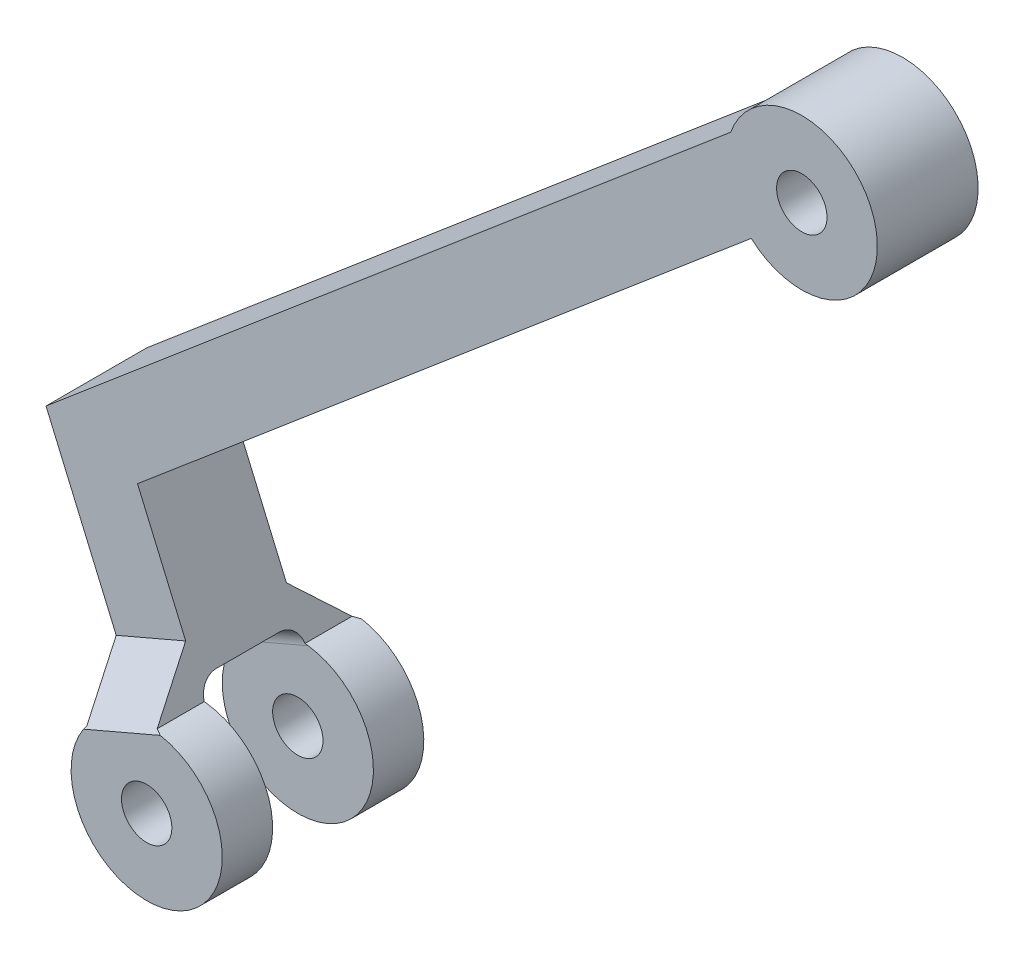
ISO-10303-21;
HEADER;
FILE_DESCRIPTION(('STEP AP214'),'2;1');
FILE_NAME('part.step','',(''),(''),'','','');
FILE_SCHEMA(('AUTOMOTIVE_DESIGN { 1 0 10303 214 1 1 1 1 }'));
ENDSEC;
DATA;
#1=APPLICATION_CONTEXT('core data for automotive mechanical design processes');
#2=APPLICATION_PROTOCOL_DEFINITION('international standard','automotive_design',2000,#1);
#3=PRODUCT_CONTEXT('',#1,'mechanical');
#4=PRODUCT('Part','Part','',(#3));
#5=PRODUCT_RELATED_PRODUCT_CATEGORY('part','',(#4));
#6=PRODUCT_DEFINITION_FORMATION('','',#4);
#7=PRODUCT_DEFINITION_CONTEXT('part definition',#1,'design');
#8=PRODUCT_DEFINITION('design','',#6,#7);
#9=PRODUCT_DEFINITION_SHAPE('','',#8);
#10=(LENGTH_UNIT() NAMED_UNIT(*) SI_UNIT(.MILLI.,.METRE.));
#11=(NAMED_UNIT(*) PLANE_ANGLE_UNIT() SI_UNIT($,.RADIAN.));
#12=(NAMED_UNIT(*) SI_UNIT($,.STERADIAN.) SOLID_ANGLE_UNIT());
#13=UNCERTAINTY_MEASURE_WITH_UNIT(LENGTH_MEASURE(1.E-05),#10,'distance_accuracy_value','');
#14=(GEOMETRIC_REPRESENTATION_CONTEXT(3) GLOBAL_UNCERTAINTY_ASSIGNED_CONTEXT((#13)) GLOBAL_UNIT_ASSIGNED_CONTEXT((#10,
#11,#12)) REPRESENTATION_CONTEXT('',''));
#15=CARTESIAN_POINT('',(0.,0.,0.));
#16=DIRECTION('',(0.,0.,1.));
#17=DIRECTION('',(1.,0.,0.));
#18=AXIS2_PLACEMENT_3D('',#15,#16,#17);
#19=CARTESIAN_POINT('',(17.8900769018501,43.1295249088939,2.));
#20=DIRECTION('',(0.,0.,-1.));
#21=DIRECTION('',(-1.,0.,0.));
#22=AXIS2_PLACEMENT_3D('',#19,#20,#21);
#23=CYLINDRICAL_SURFACE('',#22,3.);
#24=CARTESIAN_POINT('',(17.8900769018501,43.1295249088939,4.));
#25=DIRECTION('',(0.,0.,1.));
#26=DIRECTION('',(1.,0.,0.));
#27=AXIS2_PLACEMENT_3D('',#24,#25,#26);
#28=CIRCLE('',#27,3.);
#29=CARTESIAN_POINT('',(15.3798128280835,44.77225869133,4.));
#30=VERTEX_POINT('',#29);
#31=CARTESIAN_POINT('',(18.427288536158,46.081033618006,4.));
#32=VERTEX_POINT('',#31);
#33=EDGE_CURVE('E314',#30,#32,#28,.T.);
#34=ORIENTED_EDGE('',*,*,#33,.F.);
#35=CARTESIAN_POINT('',(17.8900769018501,43.1295249088939,6.50000000000002));
#36=DIRECTION('',(-0.279031751915575,0.649724004037812,0.707106781186546));
#37=DIRECTION('',(-0.279031751915574,0.649724004037809,-0.707106781186549));
#38=AXIS2_PLACEMENT_3D('',#35,#36,#37);
#39=ELLIPSE('',#38,4.24264068711929,3.);
#40=CARTESIAN_POINT('',(15.4453576268852,44.8683025446527,3.93761491463644));
#41=VERTEX_POINT('',#40);
#42=EDGE_CURVE('E241',#30,#41,#39,.F.);
#43=ORIENTED_EDGE('',*,*,#42,.T.);
#44=DIRECTION('',(0.,0.,-1.));
#45=VECTOR('',#44,1.);
#46=CARTESIAN_POINT('',(15.4453576268852,44.8683025446527,2.));
#47=LINE('',#46,#45);
#48=CARTESIAN_POINT('',(15.4453576268852,44.8683025446527,2.));
#49=VERTEX_POINT('',#48);
#50=EDGE_CURVE('E182',#41,#49,#47,.T.);
#51=ORIENTED_EDGE('',*,*,#50,.T.);
#52=CARTESIAN_POINT('',(17.8900769018501,43.1295249088939,2.));
#53=DIRECTION('',(0.,0.,1.));
#54=DIRECTION('',(0.,-1.,0.));
#55=AXIS2_PLACEMENT_3D('',#52,#53,#54);
#56=CIRCLE('',#55,3.);
#57=CARTESIAN_POINT('',(18.3057004485782,46.1005949295103,2.));
#58=VERTEX_POINT('',#57);
#59=EDGE_CURVE('E210',#49,#58,#56,.T.);
#60=ORIENTED_EDGE('',*,*,#59,.T.);
#61=CARTESIAN_POINT('',(18.3057004485782,46.1005949295103,2.));
#62=CARTESIAN_POINT('',(18.2838749316499,46.1036478178896,1.99998179933336));
#63=CARTESIAN_POINT('',(18.2620262021173,46.1064592426506,1.99973056854574));
#64=CARTESIAN_POINT('',(18.2182823177778,46.1115991649439,1.99876204672711));
#65=CARTESIAN_POINT('',(18.1963871629708,46.1139276624746,1.9980447556947));
#66=CARTESIAN_POINT('',(18.1744687955593,46.1160146963857,1.99709443453991));
#67=B_SPLINE_CURVE_WITH_KNOTS('',3,(#61,#62,#63,#64,#65,#66),.UNSPECIFIED.,.F.,.F.,(4,2,4),(0.,
0.066090906141132,0.132181812480776),.UNSPECIFIED.);
#68=CARTESIAN_POINT('',(18.1744687955593,46.1160146963857,1.99709443453986));
#69=VERTEX_POINT('',#68);
#70=EDGE_CURVE('E399',#58,#69,#67,.T.);
#71=ORIENTED_EDGE('',*,*,#70,.T.);
#72=DIRECTION('',(0.,0.,-1.));
#73=VECTOR('',#72,1.);
#74=CARTESIAN_POINT('',(18.1744687955593,46.1160146963857,2.));
#75=LINE('',#74,#73);
#76=CARTESIAN_POINT('',(18.1744687955593,46.1160146963857,3.86809236747523));
#77=VERTEX_POINT('',#76);
#78=EDGE_CURVE('E59',#77,#69,#75,.T.);
#79=ORIENTED_EDGE('',*,*,#78,.F.);
#80=CARTESIAN_POINT('',(17.8900769018501,43.1295249088939,6.50000000000002));
#81=DIRECTION('',(-0.279031751915575,0.649724004037812,0.707106781186546));
#82=DIRECTION('',(-0.279031751915574,0.649724004037809,-0.707106781186549));
#83=AXIS2_PLACEMENT_3D('',#80,#81,#82);
#84=ELLIPSE('',#83,4.24264068711929,3.);
#85=EDGE_CURVE('E238',#77,#32,#84,.F.);
#86=ORIENTED_EDGE('',*,*,#85,.T.);
#87=EDGE_LOOP('',(#34,#43,#51,#60,#71,#79,#86));
#88=FACE_BOUND('',#87,.T.);
#89=ADVANCED_FACE('F42',(#88),#23,.T.);
#90=CARTESIAN_POINT('',(17.8900769018501,43.1295249088939,2.));
#91=DIRECTION('',(0.,0.,-1.));
#92=DIRECTION('',(-1.,0.,0.));
#93=AXIS2_PLACEMENT_3D('',#90,#91,#92);
#94=CYLINDRICAL_SURFACE('',#93,1.);
#95=CARTESIAN_POINT('',(17.8900769018501,43.1295249088939,2.));
#96=DIRECTION('',(0.,0.,1.));
#97=DIRECTION('',(0.,-1.,0.));
#98=AXIS2_PLACEMENT_3D('',#95,#96,#97);
#99=CIRCLE('',#98,1.);
#100=CARTESIAN_POINT('',(17.8900769018501,42.1295249088939,2.));
#101=VERTEX_POINT('',#100);
#102=EDGE_CURVE('E176',#101,#101,#99,.T.);
#103=ORIENTED_EDGE('',*,*,#102,.F.);
#104=EDGE_LOOP('',(#103));
#105=FACE_BOUND('',#104,.T.);
#106=CARTESIAN_POINT('',(17.8900769018501,43.1295249088939,4.));
#107=DIRECTION('',(0.,0.,1.));
#108=DIRECTION('',(1.,0.,0.));
#109=AXIS2_PLACEMENT_3D('',#106,#107,#108);
#110=CIRCLE('',#109,0.999999999999998);
#111=CARTESIAN_POINT('',(18.8900769018501,43.1295249088939,4.));
#112=VERTEX_POINT('',#111);
#113=EDGE_CURVE('E328',#112,#112,#110,.T.);
#114=ORIENTED_EDGE('',*,*,#113,.T.);
#115=EDGE_LOOP('',(#114));
#116=FACE_BOUND('',#115,.T.);
#117=ADVANCED_FACE('F303',(#105,#116),#94,.F.);
#118=CARTESIAN_POINT('',(0.,0.,2.));
#119=DIRECTION('',(0.,0.,1.));
#120=DIRECTION('',(1.,0.,0.));
#121=AXIS2_PLACEMENT_3D('',#118,#119,#120);
#122=PLANE('',#121);
#123=CARTESIAN_POINT('',(41.8945256681437,75.1261878509319,2.));
#124=DIRECTION('',(0.,0.,1.));
#125=DIRECTION('',(1.,0.,0.));
#126=AXIS2_PLACEMENT_3D('',#123,#124,#125);
#127=CIRCLE('',#126,0.999999999999998);
#128=CARTESIAN_POINT('',(42.8945256681437,75.1261878509319,2.));
#129=VERTEX_POINT('',#128);
#130=EDGE_CURVE('E353',#129,#129,#127,.T.);
#131=ORIENTED_EDGE('',*,*,#130,.F.);
#132=EDGE_LOOP('',(#131));
#133=FACE_BOUND('',#132,.T.);
#134=DIRECTION('',(-0.394610487891735,0.918848498309622,0.));
#135=VECTOR('',#134,1.);
#136=CARTESIAN_POINT('',(29.3089207423203,12.5870668940354,2.));
#137=LINE('',#136,#135);
#138=CARTESIAN_POINT('',(14.6807544600742,46.6486770992688,2.));
#139=VERTEX_POINT('',#138);
#140=CARTESIAN_POINT('',(11.8938632358596,53.1379390294393,2.));
#141=VERTEX_POINT('',#140);
#142=EDGE_CURVE('E346',#139,#141,#137,.T.);
#143=ORIENTED_EDGE('',*,*,#142,.F.);
#144=DIRECTION('',(0.918848498309624,0.394610487891731,0.));
#145=VECTOR('',#144,1.);
#146=CARTESIAN_POINT('',(-14.628166282246,34.0616102052335,2.));
#147=LINE('',#146,#145);
#148=CARTESIAN_POINT('',(17.4372999550031,47.8325085629439,2.));
#149=VERTEX_POINT('',#148);
#150=EDGE_CURVE('E320',#139,#149,#147,.T.);
#151=ORIENTED_EDGE('',*,*,#150,.T.);
#152=DIRECTION('',(0.394610487891735,-0.918848498309622,0.));
#153=VECTOR('',#152,1.);
#154=CARTESIAN_POINT('',(32.0654662372491,13.7708983577106,2.));
#155=LINE('',#154,#153);
#156=CARTESIAN_POINT('',(15.5264342404228,52.2819495843776,2.));
#157=VERTEX_POINT('',#156);
#158=EDGE_CURVE('E349',#157,#149,#155,.T.);
#159=ORIENTED_EDGE('',*,*,#158,.F.);
#160=DIRECTION('',(-0.763351852273838,-0.64598293292478,0.));
#161=VECTOR('',#160,1.);
#162=CARTESIAN_POINT('',(-19.3017836873064,22.808733139719,2.));
#163=LINE('',#162,#161);
#164=CARTESIAN_POINT('',(39.8869482106765,72.8969205380532,2.));
#165=VERTEX_POINT('',#164);
#166=EDGE_CURVE('E334',#165,#157,#163,.T.);
#167=ORIENTED_EDGE('',*,*,#166,.F.);
#168=CARTESIAN_POINT('',(41.8945256681437,75.1261878509319,2.));
#169=DIRECTION('',(0.,0.,1.));
#170=DIRECTION('',(1.,0.,0.));
#171=AXIS2_PLACEMENT_3D('',#168,#169,#170);
#172=CIRCLE('',#171,3.);
#173=CARTESIAN_POINT('',(39.0692119800156,76.1349507386691,2.));
#174=VERTEX_POINT('',#173);
#175=EDGE_CURVE('E338',#165,#174,#172,.T.);
#176=ORIENTED_EDGE('',*,*,#175,.T.);
#177=DIRECTION('',(0.763351852273837,0.645982932924781,0.));
#178=VECTOR('',#177,1.);
#179=CARTESIAN_POINT('',(-21.2397324860807,25.0987886965404,2.));
#180=LINE('',#179,#178);
#181=EDGE_CURVE('E342',#141,#174,#180,.T.);
#182=ORIENTED_EDGE('',*,*,#181,.F.);
#183=EDGE_LOOP('',(#143,#151,#159,#167,#176,#182));
#184=FACE_BOUND('',#183,.T.);
#185=ADVANCED_FACE('F308',(#133,#184),#122,.T.);
#186=CARTESIAN_POINT('',(0.,0.,-2.));
#187=DIRECTION('',(0.,0.,1.));
#188=DIRECTION('',(1.,0.,0.));
#189=AXIS2_PLACEMENT_3D('',#186,#187,#188);
#190=PLANE('',#189);
#191=CARTESIAN_POINT('',(41.8945256681437,75.1261878509319,-2.));
#192=DIRECTION('',(0.,0.,1.));
#193=DIRECTION('',(1.,0.,0.));
#194=AXIS2_PLACEMENT_3D('',#191,#192,#193);
#195=CIRCLE('',#194,0.999999999999998);
#196=CARTESIAN_POINT('',(42.8945256681437,75.1261878509319,-2.));
#197=VERTEX_POINT('',#196);
#198=EDGE_CURVE('E339',#197,#197,#195,.T.);
#199=ORIENTED_EDGE('',*,*,#198,.T.);
#200=EDGE_LOOP('',(#199));
#201=FACE_BOUND('',#200,.T.);
#202=DIRECTION('',(0.918848498309624,0.394610487891731,0.));
#203=VECTOR('',#202,1.);
#204=CARTESIAN_POINT('',(-14.628166282246,34.0616102052335,-2.));
#205=LINE('',#204,#203);
#206=CARTESIAN_POINT('',(14.6807544600742,46.6486770992688,-2.));
#207=VERTEX_POINT('',#206);
#208=CARTESIAN_POINT('',(17.4372999550031,47.8325085629439,-2.));
#209=VERTEX_POINT('',#208);
#210=EDGE_CURVE('E199',#207,#209,#205,.T.);
#211=ORIENTED_EDGE('',*,*,#210,.F.);
#212=DIRECTION('',(-0.394610487891735,0.918848498309622,0.));
#213=VECTOR('',#212,1.);
#214=CARTESIAN_POINT('',(29.3089207423203,12.5870668940354,-2.));
#215=LINE('',#214,#213);
#216=CARTESIAN_POINT('',(11.8938632358596,53.1379390294393,-2.));
#217=VERTEX_POINT('',#216);
#218=EDGE_CURVE('E369',#207,#217,#215,.T.);
#219=ORIENTED_EDGE('',*,*,#218,.T.);
#220=DIRECTION('',(0.763351852273837,0.645982932924781,0.));
#221=VECTOR('',#220,1.);
#222=CARTESIAN_POINT('',(-21.2397324860807,25.0987886965404,-2.));
#223=LINE('',#222,#221);
#224=CARTESIAN_POINT('',(39.0692119800156,76.1349507386691,-2.));
#225=VERTEX_POINT('',#224);
#226=EDGE_CURVE('E365',#217,#225,#223,.T.);
#227=ORIENTED_EDGE('',*,*,#226,.T.);
#228=CARTESIAN_POINT('',(41.8945256681437,75.1261878509319,-2.));
#229=DIRECTION('',(0.,0.,1.));
#230=DIRECTION('',(1.,0.,0.));
#231=AXIS2_PLACEMENT_3D('',#228,#229,#230);
#232=CIRCLE('',#231,3.);
#233=CARTESIAN_POINT('',(39.8869482106765,72.8969205380532,-2.));
#234=VERTEX_POINT('',#233);
#235=EDGE_CURVE('E361',#234,#225,#232,.T.);
#236=ORIENTED_EDGE('',*,*,#235,.F.);
#237=DIRECTION('',(-0.763351852273838,-0.64598293292478,0.));
#238=VECTOR('',#237,1.);
#239=CARTESIAN_POINT('',(-19.3017836873064,22.808733139719,-2.));
#240=LINE('',#239,#238);
#241=CARTESIAN_POINT('',(15.5264342404228,52.2819495843776,-2.));
#242=VERTEX_POINT('',#241);
#243=EDGE_CURVE('E325',#234,#242,#240,.T.);
#244=ORIENTED_EDGE('',*,*,#243,.T.);
#245=DIRECTION('',(0.394610487891735,-0.918848498309622,0.));
#246=VECTOR('',#245,1.);
#247=CARTESIAN_POINT('',(32.0654662372491,13.7708983577106,-2.));
#248=LINE('',#247,#246);
#249=EDGE_CURVE('E372',#242,#209,#248,.T.);
#250=ORIENTED_EDGE('',*,*,#249,.T.);
#251=EDGE_LOOP('',(#211,#219,#227,#236,#244,#250));
#252=FACE_BOUND('',#251,.T.);
#253=ADVANCED_FACE('F289',(#201,#252),#190,.F.);
#254=CARTESIAN_POINT('',(-19.3017836873064,22.808733139719,2.));
#255=DIRECTION('',(0.64598293292478,-0.763351852273838,0.));
#256=DIRECTION('',(0.763351852273838,0.64598293292478,0.));
#257=AXIS2_PLACEMENT_3D('',#254,#255,#256);
#258=PLANE('',#257);
#259=ORIENTED_EDGE('',*,*,#243,.F.);
#260=DIRECTION('',(0.,0.,-1.));
#261=VECTOR('',#260,1.);
#262=CARTESIAN_POINT('',(39.8869482106765,72.8969205380532,2.));
#263=LINE('',#262,#261);
#264=EDGE_CURVE('E196',#165,#234,#263,.T.);
#265=ORIENTED_EDGE('',*,*,#264,.F.);
#266=ORIENTED_EDGE('',*,*,#166,.T.);
#267=DIRECTION('',(0.,0.,-1.));
#268=VECTOR('',#267,1.);
#269=CARTESIAN_POINT('',(15.5264342404228,52.2819495843776,2.));
#270=LINE('',#269,#268);
#271=EDGE_CURVE('E357',#157,#242,#270,.T.);
#272=ORIENTED_EDGE('',*,*,#271,.T.);
#273=EDGE_LOOP('',(#259,#265,#266,#272));
#274=FACE_BOUND('',#273,.T.);
#275=ADVANCED_FACE('F285',(#274),#258,.T.);
#276=CARTESIAN_POINT('',(41.8945256681437,75.1261878509319,2.));
#277=DIRECTION('',(0.,0.,-1.));
#278=DIRECTION('',(-1.,0.,0.));
#279=AXIS2_PLACEMENT_3D('',#276,#277,#278);
#280=CYLINDRICAL_SURFACE('',#279,3.);
#281=ORIENTED_EDGE('',*,*,#235,.T.);
#282=DIRECTION('',(0.,0.,-1.));
#283=VECTOR('',#282,1.);
#284=CARTESIAN_POINT('',(39.0692119800156,76.1349507386691,2.));
#285=LINE('',#284,#283);
#286=EDGE_CURVE('E193',#174,#225,#285,.T.);
#287=ORIENTED_EDGE('',*,*,#286,.F.);
#288=ORIENTED_EDGE('',*,*,#175,.F.);
#289=ORIENTED_EDGE('',*,*,#264,.T.);
#290=EDGE_LOOP('',(#281,#287,#288,#289));
#291=FACE_BOUND('',#290,.T.);
#292=ADVANCED_FACE('F288',(#291),#280,.T.);
#293=CARTESIAN_POINT('',(-21.2397324860807,25.0987886965404,2.));
#294=DIRECTION('',(-0.645982932924781,0.763351852273837,0.));
#295=DIRECTION('',(-0.763351852273837,-0.645982932924781,0.));
#296=AXIS2_PLACEMENT_3D('',#293,#294,#295);
#297=PLANE('',#296);
#298=ORIENTED_EDGE('',*,*,#226,.F.);
#299=DIRECTION('',(0.,0.,-1.));
#300=VECTOR('',#299,1.);
#301=CARTESIAN_POINT('',(11.8938632358596,53.1379390294393,2.));
#302=LINE('',#301,#300);
#303=EDGE_CURVE('E186',#141,#217,#302,.T.);
#304=ORIENTED_EDGE('',*,*,#303,.F.);
#305=ORIENTED_EDGE('',*,*,#181,.T.);
#306=ORIENTED_EDGE('',*,*,#286,.T.);
#307=EDGE_LOOP('',(#298,#304,#305,#306));
#308=FACE_BOUND('',#307,.T.);
#309=ADVANCED_FACE('F293',(#308),#297,.T.);
#310=CARTESIAN_POINT('',(29.3089207423203,12.5870668940354,2.));
#311=DIRECTION('',(-0.918848498309622,-0.394610487891735,0.));
#312=DIRECTION('',(0.394610487891735,-0.918848498309622,0.));
#313=AXIS2_PLACEMENT_3D('',#310,#311,#312);
#314=PLANE('',#313);
#315=ORIENTED_EDGE('',*,*,#218,.F.);
#316=DIRECTION('',(-0.279031751915578,0.649724004037811,0.707106781186545));
#317=VECTOR('',#316,1.);
#318=CARTESIAN_POINT('',(21.2056166254138,31.4555689932712,-18.5349436103425));
#319=LINE('',#318,#317);
#320=CARTESIAN_POINT('',(15.4453576268852,44.8683025446527,-3.93761491463642));
#321=VERTEX_POINT('',#320);
#322=EDGE_CURVE('E180',#207,#321,#319,.F.);
#323=ORIENTED_EDGE('',*,*,#322,.T.);
#324=CARTESIAN_POINT('',(15.4453576268852,44.8683025446527,-2.));
#325=VERTEX_POINT('',#324);
#326=EDGE_CURVE('E159',#325,#321,#47,.T.);
#327=ORIENTED_EDGE('',*,*,#326,.F.);
#328=DIRECTION('',(0.394610487891735,-0.918848498309622,0.));
#329=VECTOR('',#328,1.);
#330=CARTESIAN_POINT('',(29.3089207423203,12.5870668940354,-2.));
#331=LINE('',#330,#329);
#332=CARTESIAN_POINT('',(15.4439493682441,44.87158166768,-2.));
#333=VERTEX_POINT('',#332);
#334=EDGE_CURVE('E166',#333,#325,#331,.T.);
#335=ORIENTED_EDGE('',*,*,#334,.F.);
#336=CARTESIAN_POINT('',(15.4439493682441,44.87158166768,-1.25));
#337=DIRECTION('',(-0.918848498309622,-0.394610487891735,0.));
#338=DIRECTION('',(0.394610487891735,-0.918848498309622,0.));
#339=AXIS2_PLACEMENT_3D('',#336,#337,#338);
#340=CIRCLE('',#339,0.75);
#341=CARTESIAN_POINT('',(15.1479915023253,45.5607180414122,-1.25));
#342=VERTEX_POINT('',#341);
#343=EDGE_CURVE('E267',#333,#342,#340,.F.);
#344=ORIENTED_EDGE('',*,*,#343,.T.);
#345=DIRECTION('',(0.,0.,-1.));
#346=VECTOR('',#345,1.);
#347=CARTESIAN_POINT('',(15.1479915023253,45.5607180414122,2.));
#348=LINE('',#347,#346);
#349=CARTESIAN_POINT('',(15.1479915023253,45.5607180414122,1.25));
#350=VERTEX_POINT('',#349);
#351=EDGE_CURVE('E415',#350,#342,#348,.T.);
#352=ORIENTED_EDGE('',*,*,#351,.F.);
#353=CARTESIAN_POINT('',(15.4439493682441,44.87158166768,1.25));
#354=DIRECTION('',(-0.918848498309622,-0.394610487891735,0.));
#355=DIRECTION('',(0.394610487891735,-0.918848498309622,0.));
#356=AXIS2_PLACEMENT_3D('',#353,#354,#355);
#357=CIRCLE('',#356,0.75);
#358=CARTESIAN_POINT('',(15.4439493682441,44.87158166768,2.));
#359=VERTEX_POINT('',#358);
#360=EDGE_CURVE('E11',#350,#359,#357,.F.);
#361=ORIENTED_EDGE('',*,*,#360,.T.);
#362=DIRECTION('',(-0.394610487891735,0.918848498309622,0.));
#363=VECTOR('',#362,1.);
#364=CARTESIAN_POINT('',(29.3089207423203,12.5870668940354,2.));
#365=LINE('',#364,#363);
#366=EDGE_CURVE('E420',#49,#359,#365,.T.);
#367=ORIENTED_EDGE('',*,*,#366,.F.);
#368=ORIENTED_EDGE('',*,*,#50,.F.);
#369=DIRECTION('',(-0.279031751915577,0.649724004037808,-0.707106781186549));
#370=VECTOR('',#369,1.);
#371=CARTESIAN_POINT('',(21.9948376011972,29.6178719966522,20.5349436103424));
#372=LINE('',#371,#370);
#373=EDGE_CURVE('E214',#41,#139,#372,.T.);
#374=ORIENTED_EDGE('',*,*,#373,.T.);
#375=ORIENTED_EDGE('',*,*,#142,.T.);
#376=ORIENTED_EDGE('',*,*,#303,.T.);
#377=EDGE_LOOP('',(#315,#323,#327,#335,#344,#352,#361,#367,#368,#374,#375,#376));
#378=FACE_BOUND('',#377,.T.);
#379=ADVANCED_FACE('F179',(#378),#314,.T.);
#380=ORIENTED_EDGE('',*,*,#326,.T.);
#381=CARTESIAN_POINT('',(17.8900769018501,43.1295249088939,-6.49999999999998));
#382=DIRECTION('',(0.279031751915574,-0.649724004037809,0.70710678118655));
#383=DIRECTION('',(0.279031751915576,-0.649724004037813,-0.707106781186545));
#384=AXIS2_PLACEMENT_3D('',#381,#382,#383);
#385=ELLIPSE('',#384,4.24264068711927,3.);
#386=CARTESIAN_POINT('',(15.3798128280835,44.77225869133,-4.));
#387=VERTEX_POINT('',#386);
#388=EDGE_CURVE('E222',#321,#387,#385,.T.);
#389=ORIENTED_EDGE('',*,*,#388,.T.);
#390=CARTESIAN_POINT('',(17.8900769018501,43.1295249088939,-4.));
#391=DIRECTION('',(0.,0.,1.));
#392=DIRECTION('',(1.,0.,0.));
#393=AXIS2_PLACEMENT_3D('',#390,#391,#392);
#394=CIRCLE('',#393,3.);
#395=CARTESIAN_POINT('',(18.427288536158,46.081033618006,-4.));
#396=VERTEX_POINT('',#395);
#397=EDGE_CURVE('E321',#387,#396,#394,.T.);
#398=ORIENTED_EDGE('',*,*,#397,.T.);
#399=CARTESIAN_POINT('',(17.8900769018501,43.1295249088939,-6.49999999999998));
#400=DIRECTION('',(0.279031751915574,-0.649724004037809,0.70710678118655));
#401=DIRECTION('',(0.279031751915576,-0.649724004037813,-0.707106781186545));
#402=AXIS2_PLACEMENT_3D('',#399,#400,#401);
#403=ELLIPSE('',#402,4.24264068711927,3.);
#404=CARTESIAN_POINT('',(18.1744687955593,46.1160146963857,-3.86809236747522));
#405=VERTEX_POINT('',#404);
#406=EDGE_CURVE('E219',#396,#405,#403,.T.);
#407=ORIENTED_EDGE('',*,*,#406,.T.);
#408=CARTESIAN_POINT('',(18.1744687955593,46.1160146963857,-1.99709443453986));
#409=VERTEX_POINT('',#408);
#410=EDGE_CURVE('E67',#409,#405,#75,.T.);
#411=ORIENTED_EDGE('',*,*,#410,.F.);
#412=CARTESIAN_POINT('',(18.1744687955593,46.1160146963857,-1.99709443453986));
#413=CARTESIAN_POINT('',(18.1963871629708,46.1139276624746,-1.99804475569467));
#414=CARTESIAN_POINT('',(18.2182823177778,46.1115991649439,-1.9987620467271));
#415=CARTESIAN_POINT('',(18.2620262021173,46.1064592426506,-1.99973056854575));
#416=CARTESIAN_POINT('',(18.2838749316499,46.1036478178896,-1.99998179933337));
#417=CARTESIAN_POINT('',(18.3057004485782,46.1005949295103,-2.00000000000001));
#418=B_SPLINE_CURVE_WITH_KNOTS('',3,(#412,#413,#414,#415,#416,#417),.UNSPECIFIED.,.F.,.F.,(4,2,
4),(0.,0.0660909063396428,0.132181812480774),.UNSPECIFIED.);
#419=CARTESIAN_POINT('',(18.3057004485782,46.1005949295103,-2.));
#420=VERTEX_POINT('',#419);
#421=EDGE_CURVE('E162',#409,#420,#418,.T.);
#422=ORIENTED_EDGE('',*,*,#421,.T.);
#423=CARTESIAN_POINT('',(17.8900769018501,43.1295249088939,-2.));
#424=DIRECTION('',(0.,0.,-1.));
#425=DIRECTION('',(0.,1.,0.));
#426=AXIS2_PLACEMENT_3D('',#423,#424,#425);
#427=CIRCLE('',#426,3.);
#428=EDGE_CURVE('E155',#420,#325,#427,.T.);
#429=ORIENTED_EDGE('',*,*,#428,.T.);
#430=EDGE_LOOP('',(#380,#389,#398,#407,#411,#422,#429));
#431=FACE_BOUND('',#430,.T.);
#432=ADVANCED_FACE('F157',(#431),#23,.T.);
#433=CARTESIAN_POINT('',(32.0654662372491,13.7708983577106,2.));
#434=DIRECTION('',(0.918848498309622,0.394610487891735,0.));
#435=DIRECTION('',(-0.394610487891735,0.918848498309622,0.));
#436=AXIS2_PLACEMENT_3D('',#433,#434,#435);
#437=PLANE('',#436);
#438=ORIENTED_EDGE('',*,*,#410,.T.);
#439=DIRECTION('',(0.279031751915579,-0.649724004037811,-0.707106781186545));
#440=VECTOR('',#439,1.);
#441=CARTESIAN_POINT('',(23.9621621203427,32.6394004569464,-18.5349436103424));
#442=LINE('',#441,#440);
#443=EDGE_CURVE('E231',#405,#209,#442,.F.);
#444=ORIENTED_EDGE('',*,*,#443,.T.);
#445=ORIENTED_EDGE('',*,*,#249,.F.);
#446=ORIENTED_EDGE('',*,*,#271,.F.);
#447=ORIENTED_EDGE('',*,*,#158,.T.);
#448=DIRECTION('',(0.279031751915577,-0.649724004037808,0.707106781186549));
#449=VECTOR('',#448,1.);
#450=CARTESIAN_POINT('',(24.7513830961261,30.8017034603274,20.5349436103424));
#451=LINE('',#450,#449);
#452=EDGE_CURVE('E228',#149,#77,#451,.T.);
#453=ORIENTED_EDGE('',*,*,#452,.T.);
#454=ORIENTED_EDGE('',*,*,#78,.T.);
#455=CARTESIAN_POINT('',(18.2004948631729,46.0554131313552,1.25));
#456=DIRECTION('',(0.918848498309622,0.394610487891735,0.));
#457=DIRECTION('',(-0.394610487891735,0.918848498309622,0.));
#458=AXIS2_PLACEMENT_3D('',#455,#456,#457);
#459=CIRCLE('',#458,0.75);
#460=CARTESIAN_POINT('',(17.9045369972541,46.7445495050874,1.25));
#461=VERTEX_POINT('',#460);
#462=EDGE_CURVE('E52',#69,#461,#459,.F.);
#463=ORIENTED_EDGE('',*,*,#462,.T.);
#464=DIRECTION('',(0.,0.,1.));
#465=VECTOR('',#464,1.);
#466=CARTESIAN_POINT('',(17.9045369972541,46.7445495050874,2.));
#467=LINE('',#466,#465);
#468=CARTESIAN_POINT('',(17.9045369972541,46.7445495050874,-1.25));
#469=VERTEX_POINT('',#468);
#470=EDGE_CURVE('E203',#469,#461,#467,.T.);
#471=ORIENTED_EDGE('',*,*,#470,.F.);
#472=CARTESIAN_POINT('',(18.2004948631729,46.0554131313552,-1.25));
#473=DIRECTION('',(0.918848498309622,0.394610487891735,0.));
#474=DIRECTION('',(-0.394610487891735,0.918848498309622,0.));
#475=AXIS2_PLACEMENT_3D('',#472,#473,#474);
#476=CIRCLE('',#475,0.75);
#477=EDGE_CURVE('E257',#469,#409,#476,.F.);
#478=ORIENTED_EDGE('',*,*,#477,.T.);
#479=EDGE_LOOP('',(#438,#444,#445,#446,#447,#453,#454,#463,#471,#478));
#480=FACE_BOUND('',#479,.T.);
#481=ADVANCED_FACE('F301',(#480),#437,.T.);
#482=CARTESIAN_POINT('',(41.8945256681437,75.1261878509319,2.));
#483=DIRECTION('',(0.,0.,-1.));
#484=DIRECTION('',(-1.,0.,0.));
#485=AXIS2_PLACEMENT_3D('',#482,#483,#484);
#486=CYLINDRICAL_SURFACE('',#485,0.999999999999998);
#487=ORIENTED_EDGE('',*,*,#130,.T.);
#488=EDGE_LOOP('',(#487));
#489=FACE_BOUND('',#488,.T.);
#490=ORIENTED_EDGE('',*,*,#198,.F.);
#491=EDGE_LOOP('',(#490));
#492=FACE_BOUND('',#491,.T.);
#493=ADVANCED_FACE('F449',(#489,#492),#486,.F.);
#494=CARTESIAN_POINT('',(17.8900769018501,43.1295249088939,-4.));
#495=DIRECTION('',(0.,0.,1.));
#496=DIRECTION('',(1.,0.,0.));
#497=AXIS2_PLACEMENT_3D('',#494,#495,#496);
#498=PLANE('',#497);
#499=ORIENTED_EDGE('',*,*,#397,.F.);
#500=DIRECTION('',(0.918848498309624,0.394610487891731,0.));
#501=VECTOR('',#500,1.);
#502=CARTESIAN_POINT('',(16.9035506821208,45.426646154668,-4.));
#503=LINE('',#502,#501);
#504=EDGE_CURVE('E225',#387,#396,#503,.T.);
#505=ORIENTED_EDGE('',*,*,#504,.T.);
#506=EDGE_LOOP('',(#499,#505));
#507=FACE_BOUND('',#506,.T.);
#508=CARTESIAN_POINT('',(17.8900769018501,43.1295249088939,-4.));
#509=DIRECTION('',(0.,0.,1.));
#510=DIRECTION('',(1.,0.,0.));
#511=AXIS2_PLACEMENT_3D('',#508,#509,#510);
#512=CIRCLE('',#511,0.999999999999998);
#513=CARTESIAN_POINT('',(18.8900769018501,43.1295249088939,-4.));
#514=VERTEX_POINT('',#513);
#515=EDGE_CURVE('E331',#514,#514,#512,.T.);
#516=ORIENTED_EDGE('',*,*,#515,.T.);
#517=EDGE_LOOP('',(#516));
#518=FACE_BOUND('',#517,.T.);
#519=ADVANCED_FACE('F443',(#507,#518),#498,.F.);
#520=CARTESIAN_POINT('',(17.8900769018501,43.1295249088939,-2.));
#521=DIRECTION('',(0.,0.,-1.));
#522=DIRECTION('',(0.,1.,0.));
#523=AXIS2_PLACEMENT_3D('',#520,#521,#522);
#524=CIRCLE('',#523,1.);
#525=CARTESIAN_POINT('',(17.8900769018501,44.1295249088939,-2.));
#526=VERTEX_POINT('',#525);
#527=EDGE_CURVE('E167',#526,#526,#524,.T.);
#528=ORIENTED_EDGE('',*,*,#527,.F.);
#529=EDGE_LOOP('',(#528));
#530=FACE_BOUND('',#529,.T.);
#531=ORIENTED_EDGE('',*,*,#515,.F.);
#532=EDGE_LOOP('',(#531));
#533=FACE_BOUND('',#532,.T.);
#534=ADVANCED_FACE('F311',(#530,#533),#94,.F.);
#535=CARTESIAN_POINT('',(17.8900769018501,43.1295249088939,4.));
#536=DIRECTION('',(0.,0.,1.));
#537=DIRECTION('',(1.,0.,0.));
#538=AXIS2_PLACEMENT_3D('',#535,#536,#537);
#539=PLANE('',#538);
#540=ORIENTED_EDGE('',*,*,#33,.T.);
#541=DIRECTION('',(-0.918848498309624,-0.394610487891731,0.));
#542=VECTOR('',#541,1.);
#543=CARTESIAN_POINT('',(15.4699754358577,44.8109801026495,4.));
#544=LINE('',#543,#542);
#545=EDGE_CURVE('E234',#32,#30,#544,.T.);
#546=ORIENTED_EDGE('',*,*,#545,.T.);
#547=EDGE_LOOP('',(#540,#546));
#548=FACE_BOUND('',#547,.T.);
#549=ORIENTED_EDGE('',*,*,#113,.F.);
#550=EDGE_LOOP('',(#549));
#551=FACE_BOUND('',#550,.T.);
#552=ADVANCED_FACE('F433',(#548,#551),#539,.T.);
#553=CARTESIAN_POINT('',(13.7854954917247,35.7248688974892,2.));
#554=DIRECTION('',(0.,0.,1.));
#555=DIRECTION('',(0.,-1.,0.));
#556=AXIS2_PLACEMENT_3D('',#553,#554,#555);
#557=PLANE('',#556);
#558=ORIENTED_EDGE('',*,*,#366,.T.);
#559=DIRECTION('',(0.918848498309622,0.394610487891735,0.));
#560=VECTOR('',#559,1.);
#561=CARTESIAN_POINT('',(18.2004948631729,46.0554131313552,2.));
#562=LINE('',#561,#560);
#563=EDGE_CURVE('E253',#359,#58,#562,.T.);
#564=ORIENTED_EDGE('',*,*,#563,.T.);
#565=ORIENTED_EDGE('',*,*,#59,.F.);
#566=EDGE_LOOP('',(#558,#564,#565));
#567=FACE_BOUND('',#566,.T.);
#568=ORIENTED_EDGE('',*,*,#102,.T.);
#569=EDGE_LOOP('',(#568));
#570=FACE_BOUND('',#569,.T.);
#571=ADVANCED_FACE('F435',(#567,#570),#557,.F.);
#572=CARTESIAN_POINT('',(10.4313063446449,43.535081133121,-2.));
#573=DIRECTION('',(-0.394610487891735,0.918848498309622,0.));
#574=DIRECTION('',(-0.918848498309622,-0.394610487891735,0.));
#575=AXIS2_PLACEMENT_3D('',#572,#573,#574);
#576=PLANE('',#575);
#577=ORIENTED_EDGE('',*,*,#351,.T.);
#578=DIRECTION('',(0.918848498309622,0.394610487891735,0.));
#579=VECTOR('',#578,1.);
#580=CARTESIAN_POINT('',(17.9045369972541,46.7445495050874,-1.25));
#581=LINE('',#580,#579);
#582=EDGE_CURVE('E247',#342,#469,#581,.T.);
#583=ORIENTED_EDGE('',*,*,#582,.T.);
#584=ORIENTED_EDGE('',*,*,#470,.T.);
#585=DIRECTION('',(0.918848498309622,0.394610487891735,0.));
#586=VECTOR('',#585,1.);
#587=CARTESIAN_POINT('',(15.1479915023253,45.5607180414122,1.25));
#588=LINE('',#587,#586);
#589=EDGE_CURVE('E244',#461,#350,#588,.F.);
#590=ORIENTED_EDGE('',*,*,#589,.T.);
#591=EDGE_LOOP('',(#577,#583,#584,#590));
#592=FACE_BOUND('',#591,.T.);
#593=ADVANCED_FACE('F418',(#592),#576,.F.);
#594=CARTESIAN_POINT('',(13.7854954917247,35.7248688974892,-2.));
#595=DIRECTION('',(0.,0.,-1.));
#596=DIRECTION('',(0.,1.,0.));
#597=AXIS2_PLACEMENT_3D('',#594,#595,#596);
#598=PLANE('',#597);
#599=ORIENTED_EDGE('',*,*,#428,.F.);
#600=DIRECTION('',(0.918848498309622,0.394610487891735,0.));
#601=VECTOR('',#600,1.);
#602=CARTESIAN_POINT('',(15.4439493682441,44.87158166768,-2.));
#603=LINE('',#602,#601);
#604=EDGE_CURVE('E172',#420,#333,#603,.F.);
#605=ORIENTED_EDGE('',*,*,#604,.T.);
#606=ORIENTED_EDGE('',*,*,#334,.T.);
#607=EDGE_LOOP('',(#599,#605,#606));
#608=FACE_BOUND('',#607,.T.);
#609=ORIENTED_EDGE('',*,*,#527,.T.);
#610=EDGE_LOOP('',(#609));
#611=FACE_BOUND('',#610,.T.);
#612=ADVANCED_FACE('F170',(#608,#611),#598,.F.);
#613=CARTESIAN_POINT('',(14.6807544600742,46.6486770992688,-2.00000000000001));
#614=DIRECTION('',(0.279031751915574,-0.649724004037809,0.70710678118655));
#615=DIRECTION('',(-0.918848498309624,-0.394610487891731,0.));
#616=AXIS2_PLACEMENT_3D('',#613,#614,#615);
#617=PLANE('',#616);
#618=ORIENTED_EDGE('',*,*,#406,.F.);
#619=ORIENTED_EDGE('',*,*,#504,.F.);
#620=ORIENTED_EDGE('',*,*,#388,.F.);
#621=ORIENTED_EDGE('',*,*,#322,.F.);
#622=ORIENTED_EDGE('',*,*,#210,.T.);
#623=ORIENTED_EDGE('',*,*,#443,.F.);
#624=EDGE_LOOP('',(#618,#619,#620,#621,#622,#623));
#625=FACE_BOUND('',#624,.T.);
#626=ADVANCED_FACE('F280',(#625),#617,.F.);
#627=CARTESIAN_POINT('',(16.9035506821208,45.426646154668,4.));
#628=DIRECTION('',(-0.279031751915575,0.649724004037812,0.707106781186546));
#629=DIRECTION('',(0.918848498309624,0.394610487891731,0.));
#630=AXIS2_PLACEMENT_3D('',#627,#628,#629);
#631=PLANE('',#630);
#632=ORIENTED_EDGE('',*,*,#452,.F.);
#633=ORIENTED_EDGE('',*,*,#150,.F.);
#634=ORIENTED_EDGE('',*,*,#373,.F.);
#635=ORIENTED_EDGE('',*,*,#42,.F.);
#636=ORIENTED_EDGE('',*,*,#545,.F.);
#637=ORIENTED_EDGE('',*,*,#85,.F.);
#638=EDGE_LOOP('',(#632,#633,#634,#635,#636,#637));
#639=FACE_BOUND('',#638,.T.);
#640=ADVANCED_FACE('F276',(#639),#631,.T.);
#641=CARTESIAN_POINT('',(10.7272642105637,42.8459447593888,-1.25));
#642=DIRECTION('',(-0.918848498309622,-0.394610487891735,0.));
#643=DIRECTION('',(0.394610487891735,-0.918848498309622,0.));
#644=AXIS2_PLACEMENT_3D('',#641,#642,#643);
#645=CYLINDRICAL_SURFACE('',#644,0.75);
#646=ORIENTED_EDGE('',*,*,#343,.F.);
#647=ORIENTED_EDGE('',*,*,#604,.F.);
#648=ORIENTED_EDGE('',*,*,#421,.F.);
#649=ORIENTED_EDGE('',*,*,#477,.F.);
#650=ORIENTED_EDGE('',*,*,#582,.F.);
#651=EDGE_LOOP('',(#646,#647,#648,#649,#650));
#652=FACE_BOUND('',#651,.T.);
#653=ADVANCED_FACE('F272',(#652),#645,.F.);
#654=CARTESIAN_POINT('',(10.7272642105637,42.8459447593888,1.25));
#655=DIRECTION('',(-0.918848498309622,-0.394610487891735,0.));
#656=DIRECTION('',(0.394610487891735,-0.918848498309622,0.));
#657=AXIS2_PLACEMENT_3D('',#654,#655,#656);
#658=CYLINDRICAL_SURFACE('',#657,0.75);
#659=ORIENTED_EDGE('',*,*,#360,.F.);
#660=ORIENTED_EDGE('',*,*,#589,.F.);
#661=ORIENTED_EDGE('',*,*,#462,.F.);
#662=ORIENTED_EDGE('',*,*,#70,.F.);
#663=ORIENTED_EDGE('',*,*,#563,.F.);
#664=EDGE_LOOP('',(#659,#660,#661,#662,#663));
#665=FACE_BOUND('',#664,.T.);
#666=ADVANCED_FACE('F44',(#665),#658,.F.);
#667=CLOSED_SHELL('',(#89,#117,#185,#253,#275,#292,#309,#379,#432,#481,#493,#519,#534,#552,#571,
#593,#612,#626,#640,#653,#666));
#668=MANIFOLD_SOLID_BREP('B2',#667);
#669=ADVANCED_BREP_SHAPE_REPRESENTATION('',(#18,#668),#14);
#670=SHAPE_DEFINITION_REPRESENTATION(#9,#669);
ENDSEC;
END-ISO-10303-21;
